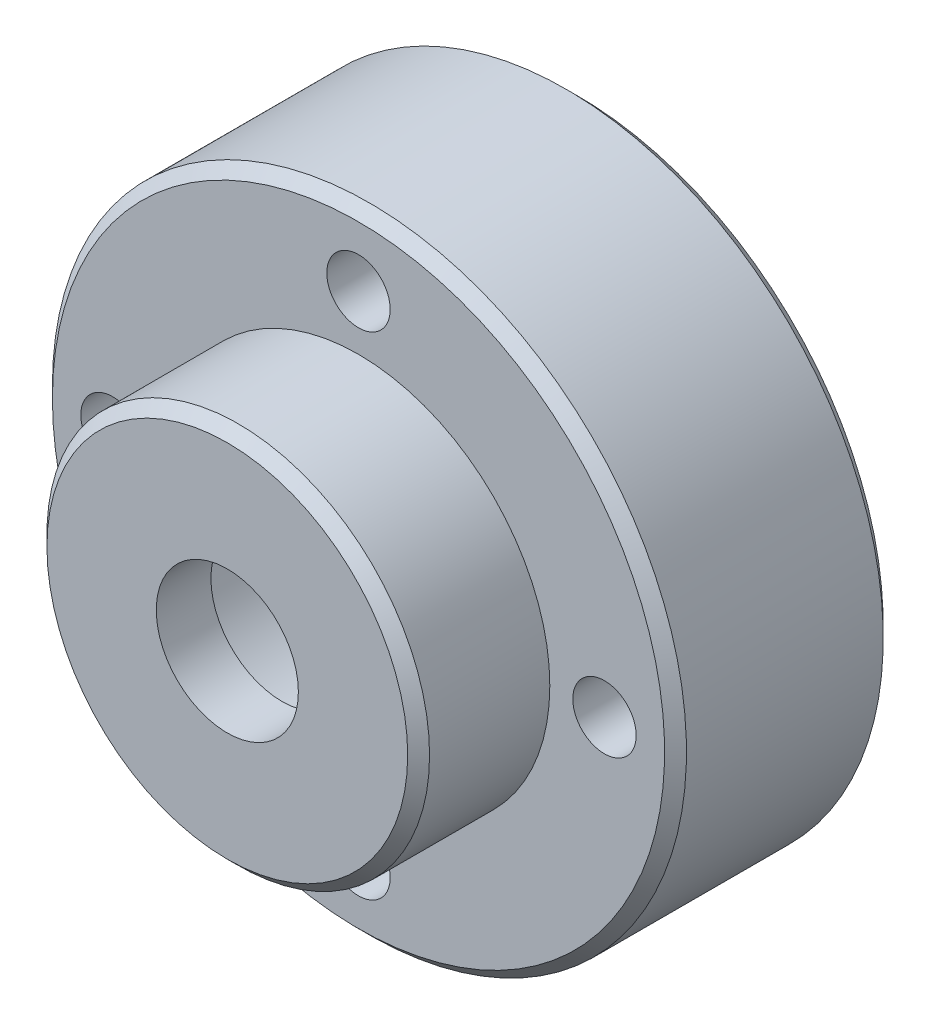
ISO-10303-21;
HEADER;
FILE_DESCRIPTION(('STEP AP214'),'2;1');
FILE_NAME('part.step','',(''),(''),'','','');
FILE_SCHEMA(('AUTOMOTIVE_DESIGN { 1 0 10303 214 1 1 1 1 }'));
ENDSEC;
DATA;
#1=APPLICATION_CONTEXT('core data for automotive mechanical design processes');
#2=APPLICATION_PROTOCOL_DEFINITION('international standard','automotive_design',2000,#1);
#3=PRODUCT_CONTEXT('',#1,'mechanical');
#4=PRODUCT('Part','Part','',(#3));
#5=PRODUCT_RELATED_PRODUCT_CATEGORY('part','',(#4));
#6=PRODUCT_DEFINITION_FORMATION('','',#4);
#7=PRODUCT_DEFINITION_CONTEXT('part definition',#1,'design');
#8=PRODUCT_DEFINITION('design','',#6,#7);
#9=PRODUCT_DEFINITION_SHAPE('','',#8);
#10=(LENGTH_UNIT() NAMED_UNIT(*) SI_UNIT(.MILLI.,.METRE.));
#11=(NAMED_UNIT(*) PLANE_ANGLE_UNIT() SI_UNIT($,.RADIAN.));
#12=(NAMED_UNIT(*) SI_UNIT($,.STERADIAN.) SOLID_ANGLE_UNIT());
#13=UNCERTAINTY_MEASURE_WITH_UNIT(LENGTH_MEASURE(1.E-05),#10,'distance_accuracy_value','');
#14=(GEOMETRIC_REPRESENTATION_CONTEXT(3) GLOBAL_UNCERTAINTY_ASSIGNED_CONTEXT((#13)) GLOBAL_UNIT_ASSIGNED_CONTEXT((#10,
#11,#12)) REPRESENTATION_CONTEXT('',''));
#15=CARTESIAN_POINT('',(0.,0.,0.));
#16=DIRECTION('',(0.,0.,1.));
#17=DIRECTION('',(1.,0.,0.));
#18=AXIS2_PLACEMENT_3D('',#15,#16,#17);
#19=CARTESIAN_POINT('',(0.,0.,-32.));
#20=DIRECTION('',(0.,0.,1.));
#21=DIRECTION('',(1.,0.,0.));
#22=AXIS2_PLACEMENT_3D('',#19,#20,#21);
#23=CYLINDRICAL_SURFACE('',#22,6.5);
#24=CARTESIAN_POINT('',(0.,0.,0.));
#25=DIRECTION('',(0.,0.,1.));
#26=DIRECTION('',(1.,0.,0.));
#27=AXIS2_PLACEMENT_3D('',#24,#25,#26);
#28=CIRCLE('',#27,6.5);
#29=CARTESIAN_POINT('',(6.5,0.,0.));
#30=VERTEX_POINT('',#29);
#31=EDGE_CURVE('E95',#30,#30,#28,.T.);
#32=ORIENTED_EDGE('',*,*,#31,.T.);
#33=EDGE_LOOP('',(#32));
#34=FACE_BOUND('',#33,.T.);
#35=CARTESIAN_POINT('',(0.,0.,-5.));
#36=DIRECTION('',(0.,0.,-1.));
#37=DIRECTION('',(-1.,0.,0.));
#38=AXIS2_PLACEMENT_3D('',#35,#36,#37);
#39=CIRCLE('',#38,6.5);
#40=CARTESIAN_POINT('',(-6.5,0.,-5.));
#41=VERTEX_POINT('',#40);
#42=EDGE_CURVE('E92',#41,#41,#39,.F.);
#43=ORIENTED_EDGE('',*,*,#42,.F.);
#44=EDGE_LOOP('',(#43));
#45=FACE_BOUND('',#44,.T.);
#46=ADVANCED_FACE('F33',(#34,#45),#23,.F.);
#47=CARTESIAN_POINT('',(0.,0.,-12.));
#48=DIRECTION('',(0.,0.,1.));
#49=DIRECTION('',(1.,0.,0.));
#50=AXIS2_PLACEMENT_3D('',#47,#48,#49);
#51=CYLINDRICAL_SURFACE('',#50,17.5);
#52=CARTESIAN_POINT('',(0.,0.,-1.00000000000002));
#53=DIRECTION('',(0.,0.,1.));
#54=DIRECTION('',(1.,0.,0.));
#55=AXIS2_PLACEMENT_3D('',#52,#53,#54);
#56=CIRCLE('',#55,17.5);
#57=CARTESIAN_POINT('',(17.5,0.,-1.00000000000002));
#58=VERTEX_POINT('',#57);
#59=EDGE_CURVE('E10',#58,#58,#56,.F.);
#60=ORIENTED_EDGE('',*,*,#59,.T.);
#61=EDGE_LOOP('',(#60));
#62=FACE_BOUND('',#61,.T.);
#63=CARTESIAN_POINT('',(0.,0.,-12.));
#64=DIRECTION('',(0.,0.,-1.));
#65=DIRECTION('',(-1.,0.,0.));
#66=AXIS2_PLACEMENT_3D('',#63,#64,#65);
#67=CIRCLE('',#66,17.5);
#68=CARTESIAN_POINT('',(-17.5,0.,-12.));
#69=VERTEX_POINT('',#68);
#70=EDGE_CURVE('E98',#69,#69,#67,.F.);
#71=ORIENTED_EDGE('',*,*,#70,.T.);
#72=EDGE_LOOP('',(#71));
#73=FACE_BOUND('',#72,.T.);
#74=ADVANCED_FACE('F135',(#62,#73),#51,.T.);
#75=CARTESIAN_POINT('',(0.,0.,0.));
#76=DIRECTION('',(0.,0.,1.));
#77=DIRECTION('',(1.,0.,0.));
#78=AXIS2_PLACEMENT_3D('',#75,#76,#77);
#79=PLANE('',#78);
#80=CARTESIAN_POINT('',(0.,0.,0.));
#81=DIRECTION('',(0.,0.,1.));
#82=DIRECTION('',(1.,0.,0.));
#83=AXIS2_PLACEMENT_3D('',#80,#81,#82);
#84=CIRCLE('',#83,16.5);
#85=CARTESIAN_POINT('',(16.5,0.,0.));
#86=VERTEX_POINT('',#85);
#87=EDGE_CURVE('E41',#86,#86,#84,.T.);
#88=ORIENTED_EDGE('',*,*,#87,.T.);
#89=EDGE_LOOP('',(#88));
#90=FACE_BOUND('',#89,.T.);
#91=ORIENTED_EDGE('',*,*,#31,.F.);
#92=EDGE_LOOP('',(#91));
#93=FACE_BOUND('',#92,.T.);
#94=ADVANCED_FACE('F126',(#90,#93),#79,.T.);
#95=CARTESIAN_POINT('',(0.,0.,-32.));
#96=DIRECTION('',(0.,0.,1.));
#97=DIRECTION('',(1.,0.,0.));
#98=AXIS2_PLACEMENT_3D('',#95,#96,#97);
#99=CYLINDRICAL_SURFACE('',#98,29.);
#100=CARTESIAN_POINT('',(0.,0.,-31.));
#101=DIRECTION('',(0.,0.,-1.));
#102=DIRECTION('',(-1.,0.,0.));
#103=AXIS2_PLACEMENT_3D('',#100,#101,#102);
#104=CIRCLE('',#103,29.);
#105=CARTESIAN_POINT('',(-29.,0.,-31.));
#106=VERTEX_POINT('',#105);
#107=EDGE_CURVE('E109',#106,#106,#104,.F.);
#108=ORIENTED_EDGE('',*,*,#107,.T.);
#109=EDGE_LOOP('',(#108));
#110=FACE_BOUND('',#109,.T.);
#111=CARTESIAN_POINT('',(0.,0.,-13.));
#112=DIRECTION('',(0.,0.,-1.));
#113=DIRECTION('',(-1.,0.,0.));
#114=AXIS2_PLACEMENT_3D('',#111,#112,#113);
#115=CIRCLE('',#114,29.);
#116=CARTESIAN_POINT('',(-29.,0.,-13.));
#117=VERTEX_POINT('',#116);
#118=EDGE_CURVE('E106',#117,#117,#115,.T.);
#119=ORIENTED_EDGE('',*,*,#118,.T.);
#120=EDGE_LOOP('',(#119));
#121=FACE_BOUND('',#120,.T.);
#122=ADVANCED_FACE('F123',(#110,#121),#99,.T.);
#123=CARTESIAN_POINT('',(0.,0.,-32.));
#124=DIRECTION('',(0.,0.,-1.));
#125=DIRECTION('',(-1.,0.,0.));
#126=AXIS2_PLACEMENT_3D('',#123,#124,#125);
#127=PLANE('',#126);
#128=CARTESIAN_POINT('',(0.,22.5,-32.));
#129=DIRECTION('',(0.,0.,-1.));
#130=DIRECTION('',(-1.,0.,0.));
#131=AXIS2_PLACEMENT_3D('',#128,#129,#130);
#132=CIRCLE('',#131,4.99999999999999);
#133=CARTESIAN_POINT('',(-4.99999999999999,22.5,-32.));
#134=VERTEX_POINT('',#133);
#135=EDGE_CURVE('E223',#134,#134,#132,.T.);
#136=ORIENTED_EDGE('',*,*,#135,.F.);
#137=EDGE_LOOP('',(#136));
#138=FACE_BOUND('',#137,.T.);
#139=CARTESIAN_POINT('',(22.5,0.,-32.));
#140=DIRECTION('',(0.,0.,-1.));
#141=DIRECTION('',(-1.,0.,0.));
#142=AXIS2_PLACEMENT_3D('',#139,#140,#141);
#143=CIRCLE('',#142,4.99999999999999);
#144=CARTESIAN_POINT('',(17.5,0.,-32.));
#145=VERTEX_POINT('',#144);
#146=EDGE_CURVE('E74',#145,#145,#143,.T.);
#147=ORIENTED_EDGE('',*,*,#146,.F.);
#148=EDGE_LOOP('',(#147));
#149=FACE_BOUND('',#148,.T.);
#150=CARTESIAN_POINT('',(0.,-22.5,-32.));
#151=DIRECTION('',(0.,0.,-1.));
#152=DIRECTION('',(-1.,0.,0.));
#153=AXIS2_PLACEMENT_3D('',#150,#151,#152);
#154=CIRCLE('',#153,4.99999999999999);
#155=CARTESIAN_POINT('',(-4.99999999999999,-22.5,-32.));
#156=VERTEX_POINT('',#155);
#157=EDGE_CURVE('E61',#156,#156,#154,.T.);
#158=ORIENTED_EDGE('',*,*,#157,.F.);
#159=EDGE_LOOP('',(#158));
#160=FACE_BOUND('',#159,.T.);
#161=CARTESIAN_POINT('',(-22.5,0.,-32.));
#162=DIRECTION('',(0.,0.,-1.));
#163=DIRECTION('',(-1.,0.,0.));
#164=AXIS2_PLACEMENT_3D('',#161,#162,#163);
#165=CIRCLE('',#164,4.99999999999999);
#166=CARTESIAN_POINT('',(-27.5,0.,-32.));
#167=VERTEX_POINT('',#166);
#168=EDGE_CURVE('E57',#167,#167,#165,.T.);
#169=ORIENTED_EDGE('',*,*,#168,.F.);
#170=EDGE_LOOP('',(#169));
#171=FACE_BOUND('',#170,.T.);
#172=CARTESIAN_POINT('',(0.,0.,-32.));
#173=DIRECTION('',(0.,0.,-1.));
#174=DIRECTION('',(-1.,0.,0.));
#175=AXIS2_PLACEMENT_3D('',#172,#173,#174);
#176=CIRCLE('',#175,28.);
#177=CARTESIAN_POINT('',(-28.,0.,-32.));
#178=VERTEX_POINT('',#177);
#179=EDGE_CURVE('E101',#178,#178,#176,.T.);
#180=ORIENTED_EDGE('',*,*,#179,.T.);
#181=EDGE_LOOP('',(#180));
#182=FACE_BOUND('',#181,.T.);
#183=CARTESIAN_POINT('',(0.,0.,-32.));
#184=DIRECTION('',(0.,0.,-1.));
#185=DIRECTION('',(-1.,0.,0.));
#186=AXIS2_PLACEMENT_3D('',#183,#184,#185);
#187=CIRCLE('',#186,11.05);
#188=CARTESIAN_POINT('',(-11.05,0.,-32.));
#189=VERTEX_POINT('',#188);
#190=EDGE_CURVE('E53',#189,#189,#187,.T.);
#191=ORIENTED_EDGE('',*,*,#190,.F.);
#192=EDGE_LOOP('',(#191));
#193=FACE_BOUND('',#192,.T.);
#194=ADVANCED_FACE('F125',(#138,#149,#160,#171,#182,#193),#127,.T.);
#195=CARTESIAN_POINT('',(0.,0.,-12.));
#196=DIRECTION('',(0.,0.,-1.));
#197=DIRECTION('',(-1.,0.,0.));
#198=AXIS2_PLACEMENT_3D('',#195,#196,#197);
#199=PLANE('',#198);
#200=CARTESIAN_POINT('',(0.,22.5,-12.));
#201=DIRECTION('',(0.,0.,-1.));
#202=DIRECTION('',(-1.,0.,0.));
#203=AXIS2_PLACEMENT_3D('',#200,#201,#202);
#204=CIRCLE('',#203,2.9);
#205=CARTESIAN_POINT('',(-2.9,22.5,-12.));
#206=VERTEX_POINT('',#205);
#207=EDGE_CURVE('E37',#206,#206,#204,.T.);
#208=ORIENTED_EDGE('',*,*,#207,.T.);
#209=EDGE_LOOP('',(#208));
#210=FACE_BOUND('',#209,.T.);
#211=CARTESIAN_POINT('',(22.5,0.,-12.));
#212=DIRECTION('',(0.,0.,-1.));
#213=DIRECTION('',(-1.,0.,0.));
#214=AXIS2_PLACEMENT_3D('',#211,#212,#213);
#215=CIRCLE('',#214,2.9);
#216=CARTESIAN_POINT('',(19.6,0.,-12.));
#217=VERTEX_POINT('',#216);
#218=EDGE_CURVE('E59',#217,#217,#215,.T.);
#219=ORIENTED_EDGE('',*,*,#218,.T.);
#220=EDGE_LOOP('',(#219));
#221=FACE_BOUND('',#220,.T.);
#222=CARTESIAN_POINT('',(0.,-22.5,-12.));
#223=DIRECTION('',(0.,0.,-1.));
#224=DIRECTION('',(-1.,0.,0.));
#225=AXIS2_PLACEMENT_3D('',#222,#223,#224);
#226=CIRCLE('',#225,2.9);
#227=CARTESIAN_POINT('',(-2.9,-22.5,-12.));
#228=VERTEX_POINT('',#227);
#229=EDGE_CURVE('E55',#228,#228,#226,.T.);
#230=ORIENTED_EDGE('',*,*,#229,.T.);
#231=EDGE_LOOP('',(#230));
#232=FACE_BOUND('',#231,.T.);
#233=CARTESIAN_POINT('',(-22.5,0.,-12.));
#234=DIRECTION('',(0.,0.,-1.));
#235=DIRECTION('',(-1.,0.,0.));
#236=AXIS2_PLACEMENT_3D('',#233,#234,#235);
#237=CIRCLE('',#236,2.9);
#238=CARTESIAN_POINT('',(-25.4,0.,-12.));
#239=VERTEX_POINT('',#238);
#240=EDGE_CURVE('E50',#239,#239,#237,.T.);
#241=ORIENTED_EDGE('',*,*,#240,.T.);
#242=EDGE_LOOP('',(#241));
#243=FACE_BOUND('',#242,.T.);
#244=CARTESIAN_POINT('',(0.,0.,-12.));
#245=DIRECTION('',(0.,0.,-1.));
#246=DIRECTION('',(-1.,0.,0.));
#247=AXIS2_PLACEMENT_3D('',#244,#245,#246);
#248=CIRCLE('',#247,28.);
#249=CARTESIAN_POINT('',(-28.,0.,-12.));
#250=VERTEX_POINT('',#249);
#251=EDGE_CURVE('E46',#250,#250,#248,.F.);
#252=ORIENTED_EDGE('',*,*,#251,.T.);
#253=EDGE_LOOP('',(#252));
#254=FACE_BOUND('',#253,.T.);
#255=ORIENTED_EDGE('',*,*,#70,.F.);
#256=EDGE_LOOP('',(#255));
#257=FACE_BOUND('',#256,.T.);
#258=ADVANCED_FACE('F114',(#210,#221,#232,#243,#254,#257),#199,.F.);
#259=CARTESIAN_POINT('',(0.,0.,-5.));
#260=DIRECTION('',(0.,0.,-1.));
#261=DIRECTION('',(-1.,0.,0.));
#262=AXIS2_PLACEMENT_3D('',#259,#260,#261);
#263=PLANE('',#262);
#264=CARTESIAN_POINT('',(0.,0.,-5.));
#265=DIRECTION('',(0.,0.,-1.));
#266=DIRECTION('',(-1.,0.,0.));
#267=AXIS2_PLACEMENT_3D('',#264,#265,#266);
#268=CIRCLE('',#267,11.05);
#269=CARTESIAN_POINT('',(-11.05,0.,-5.));
#270=VERTEX_POINT('',#269);
#271=EDGE_CURVE('E89',#270,#270,#268,.T.);
#272=ORIENTED_EDGE('',*,*,#271,.T.);
#273=EDGE_LOOP('',(#272));
#274=FACE_BOUND('',#273,.T.);
#275=ORIENTED_EDGE('',*,*,#42,.T.);
#276=EDGE_LOOP('',(#275));
#277=FACE_BOUND('',#276,.T.);
#278=ADVANCED_FACE('F151',(#274,#277),#263,.T.);
#279=CARTESIAN_POINT('',(0.,0.,-5.));
#280=DIRECTION('',(0.,0.,-1.));
#281=DIRECTION('',(-1.,0.,0.));
#282=AXIS2_PLACEMENT_3D('',#279,#280,#281);
#283=CYLINDRICAL_SURFACE('',#282,11.05);
#284=ORIENTED_EDGE('',*,*,#271,.F.);
#285=EDGE_LOOP('',(#284));
#286=FACE_BOUND('',#285,.T.);
#287=ORIENTED_EDGE('',*,*,#190,.T.);
#288=EDGE_LOOP('',(#287));
#289=FACE_BOUND('',#288,.T.);
#290=ADVANCED_FACE('F148',(#286,#289),#283,.F.);
#291=CARTESIAN_POINT('',(0.,0.,-32.));
#292=DIRECTION('',(0.,0.,1.));
#293=DIRECTION('',(1.,0.,0.));
#294=AXIS2_PLACEMENT_3D('',#291,#292,#293);
#295=CONICAL_SURFACE('',#294,28.,0.785398163397447);
#296=ORIENTED_EDGE('',*,*,#107,.F.);
#297=EDGE_LOOP('',(#296));
#298=FACE_BOUND('',#297,.T.);
#299=ORIENTED_EDGE('',*,*,#179,.F.);
#300=EDGE_LOOP('',(#299));
#301=FACE_BOUND('',#300,.T.);
#302=ADVANCED_FACE('F120',(#298,#301),#295,.T.);
#303=CARTESIAN_POINT('',(0.,0.,-13.));
#304=DIRECTION('',(0.,0.,-1.));
#305=DIRECTION('',(-1.,0.,0.));
#306=AXIS2_PLACEMENT_3D('',#303,#304,#305);
#307=CONICAL_SURFACE('',#306,29.,0.78539816339745);
#308=ORIENTED_EDGE('',*,*,#251,.F.);
#309=EDGE_LOOP('',(#308));
#310=FACE_BOUND('',#309,.T.);
#311=ORIENTED_EDGE('',*,*,#118,.F.);
#312=EDGE_LOOP('',(#311));
#313=FACE_BOUND('',#312,.T.);
#314=ADVANCED_FACE('F117',(#310,#313),#307,.T.);
#315=CARTESIAN_POINT('',(0.,0.,0.));
#316=DIRECTION('',(0.,0.,-1.));
#317=DIRECTION('',(-1.,0.,0.));
#318=AXIS2_PLACEMENT_3D('',#315,#316,#317);
#319=CONICAL_SURFACE('',#318,16.5,0.785398163397448);
#320=ORIENTED_EDGE('',*,*,#59,.F.);
#321=EDGE_LOOP('',(#320));
#322=FACE_BOUND('',#321,.T.);
#323=ORIENTED_EDGE('',*,*,#87,.F.);
#324=EDGE_LOOP('',(#323));
#325=FACE_BOUND('',#324,.T.);
#326=ADVANCED_FACE('F35',(#322,#325),#319,.T.);
#327=CARTESIAN_POINT('',(-22.5,0.,-32.));
#328=DIRECTION('',(0.,0.,-1.));
#329=DIRECTION('',(-1.,0.,0.));
#330=AXIS2_PLACEMENT_3D('',#327,#328,#329);
#331=CYLINDRICAL_SURFACE('',#330,2.9);
#332=CARTESIAN_POINT('',(-22.5,0.,-27.));
#333=DIRECTION('',(0.,0.,-1.));
#334=DIRECTION('',(-1.,0.,0.));
#335=AXIS2_PLACEMENT_3D('',#332,#333,#334);
#336=CIRCLE('',#335,2.9);
#337=CARTESIAN_POINT('',(-25.4,0.,-27.));
#338=VERTEX_POINT('',#337);
#339=EDGE_CURVE('E54',#338,#338,#336,.T.);
#340=ORIENTED_EDGE('',*,*,#339,.T.);
#341=EDGE_LOOP('',(#340));
#342=FACE_BOUND('',#341,.T.);
#343=ORIENTED_EDGE('',*,*,#240,.F.);
#344=EDGE_LOOP('',(#343));
#345=FACE_BOUND('',#344,.T.);
#346=ADVANCED_FACE('F164',(#342,#345),#331,.F.);
#347=CARTESIAN_POINT('',(-19.6,0.,-27.));
#348=DIRECTION('',(0.,0.,1.));
#349=DIRECTION('',(1.,0.,0.));
#350=AXIS2_PLACEMENT_3D('',#347,#348,#349);
#351=PLANE('',#350);
#352=ORIENTED_EDGE('',*,*,#339,.F.);
#353=EDGE_LOOP('',(#352));
#354=FACE_BOUND('',#353,.T.);
#355=CARTESIAN_POINT('',(-22.5,0.,-27.));
#356=DIRECTION('',(0.,0.,-1.));
#357=DIRECTION('',(-1.,0.,0.));
#358=AXIS2_PLACEMENT_3D('',#355,#356,#357);
#359=CIRCLE('',#358,5.);
#360=CARTESIAN_POINT('',(-27.5,0.,-27.));
#361=VERTEX_POINT('',#360);
#362=EDGE_CURVE('E84',#361,#361,#359,.T.);
#363=ORIENTED_EDGE('',*,*,#362,.T.);
#364=EDGE_LOOP('',(#363));
#365=FACE_BOUND('',#364,.T.);
#366=ADVANCED_FACE('F166',(#354,#365),#351,.F.);
#367=CARTESIAN_POINT('',(-22.5,0.,-32.));
#368=DIRECTION('',(0.,0.,-1.));
#369=DIRECTION('',(-1.,0.,0.));
#370=AXIS2_PLACEMENT_3D('',#367,#368,#369);
#371=CYLINDRICAL_SURFACE('',#370,5.);
#372=ORIENTED_EDGE('',*,*,#362,.F.);
#373=EDGE_LOOP('',(#372));
#374=FACE_BOUND('',#373,.T.);
#375=ORIENTED_EDGE('',*,*,#168,.T.);
#376=EDGE_LOOP('',(#375));
#377=FACE_BOUND('',#376,.T.);
#378=ADVANCED_FACE('F173',(#374,#377),#371,.F.);
#379=CARTESIAN_POINT('',(0.,-22.5,-32.));
#380=DIRECTION('',(0.,0.,-1.));
#381=DIRECTION('',(-1.,0.,0.));
#382=AXIS2_PLACEMENT_3D('',#379,#380,#381);
#383=CYLINDRICAL_SURFACE('',#382,2.9);
#384=CARTESIAN_POINT('',(0.,-22.5,-27.));
#385=DIRECTION('',(0.,0.,-1.));
#386=DIRECTION('',(-1.,0.,0.));
#387=AXIS2_PLACEMENT_3D('',#384,#385,#386);
#388=CIRCLE('',#387,2.9);
#389=CARTESIAN_POINT('',(-2.9,-22.5,-27.));
#390=VERTEX_POINT('',#389);
#391=EDGE_CURVE('E58',#390,#390,#388,.T.);
#392=ORIENTED_EDGE('',*,*,#391,.T.);
#393=EDGE_LOOP('',(#392));
#394=FACE_BOUND('',#393,.T.);
#395=ORIENTED_EDGE('',*,*,#229,.F.);
#396=EDGE_LOOP('',(#395));
#397=FACE_BOUND('',#396,.T.);
#398=ADVANCED_FACE('F180',(#394,#397),#383,.F.);
#399=CARTESIAN_POINT('',(2.9,-22.5,-27.));
#400=DIRECTION('',(0.,0.,1.));
#401=DIRECTION('',(1.,0.,0.));
#402=AXIS2_PLACEMENT_3D('',#399,#400,#401);
#403=PLANE('',#402);
#404=ORIENTED_EDGE('',*,*,#391,.F.);
#405=EDGE_LOOP('',(#404));
#406=FACE_BOUND('',#405,.T.);
#407=CARTESIAN_POINT('',(0.,-22.5,-27.));
#408=DIRECTION('',(0.,0.,-1.));
#409=DIRECTION('',(-1.,0.,0.));
#410=AXIS2_PLACEMENT_3D('',#407,#408,#409);
#411=CIRCLE('',#410,5.);
#412=CARTESIAN_POINT('',(-5.,-22.5,-27.));
#413=VERTEX_POINT('',#412);
#414=EDGE_CURVE('E66',#413,#413,#411,.T.);
#415=ORIENTED_EDGE('',*,*,#414,.T.);
#416=EDGE_LOOP('',(#415));
#417=FACE_BOUND('',#416,.T.);
#418=ADVANCED_FACE('F184',(#406,#417),#403,.F.);
#419=CARTESIAN_POINT('',(0.,-22.5,-32.));
#420=DIRECTION('',(0.,0.,-1.));
#421=DIRECTION('',(-1.,0.,0.));
#422=AXIS2_PLACEMENT_3D('',#419,#420,#421);
#423=CYLINDRICAL_SURFACE('',#422,5.);
#424=ORIENTED_EDGE('',*,*,#414,.F.);
#425=EDGE_LOOP('',(#424));
#426=FACE_BOUND('',#425,.T.);
#427=ORIENTED_EDGE('',*,*,#157,.T.);
#428=EDGE_LOOP('',(#427));
#429=FACE_BOUND('',#428,.T.);
#430=ADVANCED_FACE('F188',(#426,#429),#423,.F.);
#431=CARTESIAN_POINT('',(22.5,0.,-32.));
#432=DIRECTION('',(0.,0.,-1.));
#433=DIRECTION('',(-1.,0.,0.));
#434=AXIS2_PLACEMENT_3D('',#431,#432,#433);
#435=CYLINDRICAL_SURFACE('',#434,2.9);
#436=CARTESIAN_POINT('',(22.5,0.,-27.));
#437=DIRECTION('',(0.,0.,-1.));
#438=DIRECTION('',(-1.,0.,0.));
#439=AXIS2_PLACEMENT_3D('',#436,#437,#438);
#440=CIRCLE('',#439,2.9);
#441=CARTESIAN_POINT('',(19.6,0.,-27.));
#442=VERTEX_POINT('',#441);
#443=EDGE_CURVE('E62',#442,#442,#440,.T.);
#444=ORIENTED_EDGE('',*,*,#443,.T.);
#445=EDGE_LOOP('',(#444));
#446=FACE_BOUND('',#445,.T.);
#447=ORIENTED_EDGE('',*,*,#218,.F.);
#448=EDGE_LOOP('',(#447));
#449=FACE_BOUND('',#448,.T.);
#450=ADVANCED_FACE('F192',(#446,#449),#435,.F.);
#451=CARTESIAN_POINT('',(25.4,0.,-27.));
#452=DIRECTION('',(0.,0.,1.));
#453=DIRECTION('',(1.,0.,0.));
#454=AXIS2_PLACEMENT_3D('',#451,#452,#453);
#455=PLANE('',#454);
#456=ORIENTED_EDGE('',*,*,#443,.F.);
#457=EDGE_LOOP('',(#456));
#458=FACE_BOUND('',#457,.T.);
#459=CARTESIAN_POINT('',(22.5,0.,-27.));
#460=DIRECTION('',(0.,0.,-1.));
#461=DIRECTION('',(-1.,0.,0.));
#462=AXIS2_PLACEMENT_3D('',#459,#460,#461);
#463=CIRCLE('',#462,5.);
#464=CARTESIAN_POINT('',(17.5,0.,-27.));
#465=VERTEX_POINT('',#464);
#466=EDGE_CURVE('E69',#465,#465,#463,.T.);
#467=ORIENTED_EDGE('',*,*,#466,.T.);
#468=EDGE_LOOP('',(#467));
#469=FACE_BOUND('',#468,.T.);
#470=ADVANCED_FACE('F196',(#458,#469),#455,.F.);
#471=CARTESIAN_POINT('',(22.5,0.,-32.));
#472=DIRECTION('',(0.,0.,-1.));
#473=DIRECTION('',(-1.,0.,0.));
#474=AXIS2_PLACEMENT_3D('',#471,#472,#473);
#475=CYLINDRICAL_SURFACE('',#474,5.);
#476=ORIENTED_EDGE('',*,*,#466,.F.);
#477=EDGE_LOOP('',(#476));
#478=FACE_BOUND('',#477,.T.);
#479=ORIENTED_EDGE('',*,*,#146,.T.);
#480=EDGE_LOOP('',(#479));
#481=FACE_BOUND('',#480,.T.);
#482=ADVANCED_FACE('F199',(#478,#481),#475,.F.);
#483=CARTESIAN_POINT('',(0.,22.5,-32.));
#484=DIRECTION('',(0.,0.,-1.));
#485=DIRECTION('',(-1.,0.,0.));
#486=AXIS2_PLACEMENT_3D('',#483,#484,#485);
#487=CYLINDRICAL_SURFACE('',#486,2.9);
#488=CARTESIAN_POINT('',(0.,22.5,-27.));
#489=DIRECTION('',(0.,0.,-1.));
#490=DIRECTION('',(-1.,0.,0.));
#491=AXIS2_PLACEMENT_3D('',#488,#489,#490);
#492=CIRCLE('',#491,2.9);
#493=CARTESIAN_POINT('',(-2.9,22.5,-27.));
#494=VERTEX_POINT('',#493);
#495=EDGE_CURVE('E225',#494,#494,#492,.T.);
#496=ORIENTED_EDGE('',*,*,#495,.T.);
#497=EDGE_LOOP('',(#496));
#498=FACE_BOUND('',#497,.T.);
#499=ORIENTED_EDGE('',*,*,#207,.F.);
#500=EDGE_LOOP('',(#499));
#501=FACE_BOUND('',#500,.T.);
#502=ADVANCED_FACE('F203',(#498,#501),#487,.F.);
#503=CARTESIAN_POINT('',(2.9,22.5,-27.));
#504=DIRECTION('',(0.,0.,1.));
#505=DIRECTION('',(1.,0.,0.));
#506=AXIS2_PLACEMENT_3D('',#503,#504,#505);
#507=PLANE('',#506);
#508=ORIENTED_EDGE('',*,*,#495,.F.);
#509=EDGE_LOOP('',(#508));
#510=FACE_BOUND('',#509,.T.);
#511=CARTESIAN_POINT('',(0.,22.5,-27.));
#512=DIRECTION('',(0.,0.,-1.));
#513=DIRECTION('',(-1.,0.,0.));
#514=AXIS2_PLACEMENT_3D('',#511,#512,#513);
#515=CIRCLE('',#514,5.);
#516=CARTESIAN_POINT('',(-5.,22.5,-27.));
#517=VERTEX_POINT('',#516);
#518=EDGE_CURVE('E220',#517,#517,#515,.T.);
#519=ORIENTED_EDGE('',*,*,#518,.T.);
#520=EDGE_LOOP('',(#519));
#521=FACE_BOUND('',#520,.T.);
#522=ADVANCED_FACE('F207',(#510,#521),#507,.F.);
#523=CARTESIAN_POINT('',(0.,22.5,-32.));
#524=DIRECTION('',(0.,0.,-1.));
#525=DIRECTION('',(-1.,0.,0.));
#526=AXIS2_PLACEMENT_3D('',#523,#524,#525);
#527=CYLINDRICAL_SURFACE('',#526,5.);
#528=ORIENTED_EDGE('',*,*,#518,.F.);
#529=EDGE_LOOP('',(#528));
#530=FACE_BOUND('',#529,.T.);
#531=ORIENTED_EDGE('',*,*,#135,.T.);
#532=EDGE_LOOP('',(#531));
#533=FACE_BOUND('',#532,.T.);
#534=ADVANCED_FACE('F211',(#530,#533),#527,.F.);
#535=CLOSED_SHELL('',(#46,#74,#94,#122,#194,#258,#278,#290,#302,#314,#326,#346,#366,#378,#398,
#418,#430,#450,#470,#482,#502,#522,#534));
#536=MANIFOLD_SOLID_BREP('B2',#535);
#537=ADVANCED_BREP_SHAPE_REPRESENTATION('',(#18,#536),#14);
#538=SHAPE_DEFINITION_REPRESENTATION(#9,#537);
ENDSEC;
END-ISO-10303-21;
